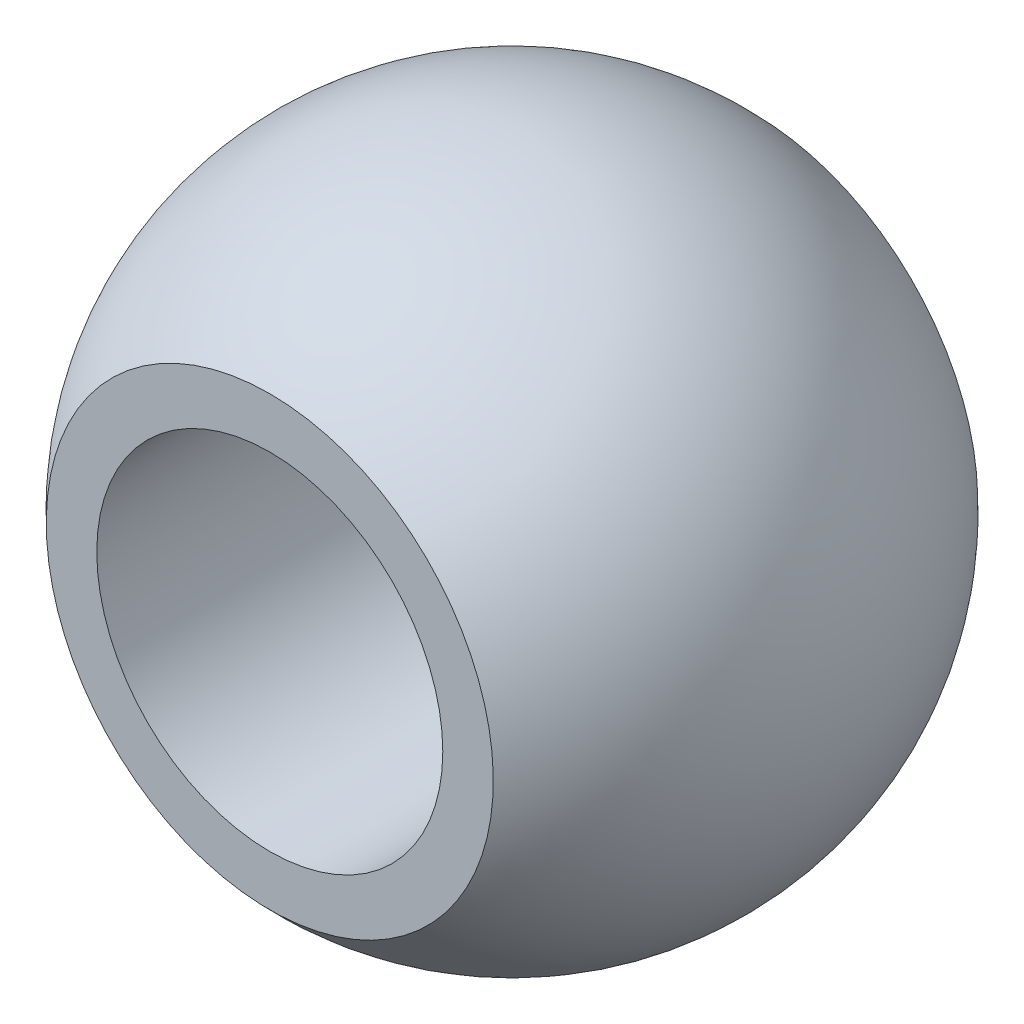
ISO-10303-21;
HEADER;
FILE_DESCRIPTION(('STEP AP214'),'2;1');
FILE_NAME('part.step','',(''),(''),'','','');
FILE_SCHEMA(('AUTOMOTIVE_DESIGN { 1 0 10303 214 1 1 1 1 }'));
ENDSEC;
DATA;
#1=APPLICATION_CONTEXT('core data for automotive mechanical design processes');
#2=APPLICATION_PROTOCOL_DEFINITION('international standard','automotive_design',2000,#1);
#3=PRODUCT_CONTEXT('',#1,'mechanical');
#4=PRODUCT('Part','Part','',(#3));
#5=PRODUCT_RELATED_PRODUCT_CATEGORY('part','',(#4));
#6=PRODUCT_DEFINITION_FORMATION('','',#4);
#7=PRODUCT_DEFINITION_CONTEXT('part definition',#1,'design');
#8=PRODUCT_DEFINITION('design','',#6,#7);
#9=PRODUCT_DEFINITION_SHAPE('','',#8);
#10=(LENGTH_UNIT() NAMED_UNIT(*) SI_UNIT(.MILLI.,.METRE.));
#11=(NAMED_UNIT(*) PLANE_ANGLE_UNIT() SI_UNIT($,.RADIAN.));
#12=(NAMED_UNIT(*) SI_UNIT($,.STERADIAN.) SOLID_ANGLE_UNIT());
#13=UNCERTAINTY_MEASURE_WITH_UNIT(LENGTH_MEASURE(1.E-05),#10,'distance_accuracy_value','');
#14=(GEOMETRIC_REPRESENTATION_CONTEXT(3) GLOBAL_UNCERTAINTY_ASSIGNED_CONTEXT((#13)) GLOBAL_UNIT_ASSIGNED_CONTEXT((#10,
#11,#12)) REPRESENTATION_CONTEXT('',''));
#15=CARTESIAN_POINT('',(0.,0.,0.));
#16=DIRECTION('',(0.,0.,1.));
#17=DIRECTION('',(1.,0.,0.));
#18=AXIS2_PLACEMENT_3D('',#15,#16,#17);
#19=CARTESIAN_POINT('',(0.,0.,0.));
#20=DIRECTION('',(0.,0.,1.));
#21=DIRECTION('',(0.,1.,0.));
#22=AXIS2_PLACEMENT_3D('',#19,#20,#21);
#23=SPHERICAL_SURFACE('',#22,9.525);
#24=CARTESIAN_POINT('',(0.,0.,7.));
#25=DIRECTION('',(0.,0.,1.));
#26=DIRECTION('',(1.,0.,0.));
#27=AXIS2_PLACEMENT_3D('',#24,#25,#26);
#28=CIRCLE('',#27,6.45953752214506);
#29=CARTESIAN_POINT('',(0.,6.45953752214506,7.));
#30=VERTEX_POINT('',#29);
#31=EDGE_CURVE('E49',#30,#30,#28,.T.);
#32=CARTESIAN_POINT('',(0.,0.,-7.));
#33=DIRECTION('',(0.,0.,1.));
#34=DIRECTION('',(1.,0.,0.));
#35=AXIS2_PLACEMENT_3D('',#32,#33,#34);
#36=CIRCLE('',#35,6.45953752214506);
#37=CARTESIAN_POINT('',(0.,6.45953752214506,-7.));
#38=VERTEX_POINT('',#37);
#39=EDGE_CURVE('E10',#38,#38,#36,.T.);
#40=CARTESIAN_POINT('',(0.,6.45953752214506,7.));
#41=CARTESIAN_POINT('',(0.,6.57993037529818,6.88890803991508));
#42=CARTESIAN_POINT('',(0.,6.69745158124721,6.77470469719588));
#43=CARTESIAN_POINT('',(0.,6.92645059857719,6.54039159966117));
#44=CARTESIAN_POINT('',(0.,7.03792840995814,6.42028184484566));
#45=CARTESIAN_POINT('',(0.,7.25454053799209,6.17447227629059));
#46=CARTESIAN_POINT('',(0.,7.35967485464508,6.04877246255103));
#47=CARTESIAN_POINT('',(0.,7.56332108630738,5.79211821958587));
#48=CARTESIAN_POINT('',(0.,7.66183300131669,5.66116379036026));
#49=CARTESIAN_POINT('',(0.,7.8519719936429,5.39434861650568));
#50=CARTESIAN_POINT('',(0.,7.9435990709598,5.25848787187671));
#51=CARTESIAN_POINT('',(0.,8.11972458546042,4.98222172800408));
#52=CARTESIAN_POINT('',(0.,8.20422302264415,4.84181632876042));
#53=CARTESIAN_POINT('',(0.,8.36586634458465,4.55683455112926));
#54=CARTESIAN_POINT('',(0.,8.44301122934143,4.41225817274177));
#55=CARTESIAN_POINT('',(0.,8.58974212802034,4.11931923517532));
#56=CARTESIAN_POINT('',(0.,8.65932814194247,3.97095667599636));
#57=CARTESIAN_POINT('',(0.,8.79075609272137,3.67084024639935));
#58=CARTESIAN_POINT('',(0.,8.85259802957815,3.51908637598129));
#59=CARTESIAN_POINT('',(0.,8.9683732326518,3.21259122107979));
#60=CARTESIAN_POINT('',(0.,9.02230649886867,3.05784993659634));
#61=CARTESIAN_POINT('',(0.,9.12212081579162,2.74579180139971));
#62=CARTESIAN_POINT('',(0.,9.1680018664977,2.58847495068653));
#63=CARTESIAN_POINT('',(0.,9.25158963882223,2.27168438591404));
#64=CARTESIAN_POINT('',(0.,9.28929636044068,2.11221067185473));
#65=CARTESIAN_POINT('',(0.,9.35643511717031,1.79153082379107));
#66=CARTESIAN_POINT('',(0.,9.38586715228148,1.63032468978673));
#67=CARTESIAN_POINT('',(0.,9.43637820187696,1.30660905612256));
#68=CARTESIAN_POINT('',(0.,9.45745721636126,1.14409955646274));
#69=CARTESIAN_POINT('',(0.,9.49120612236121,0.818209714716342));
#70=CARTESIAN_POINT('',(0.,9.50387601387686,0.654829372629771));
#71=CARTESIAN_POINT('',(0.,9.52077295269626,0.3276326870288));
#72=CARTESIAN_POINT('',(0.,9.525,0.1638163435144));
#73=CARTESIAN_POINT('',(0.,9.525,-0.163816343514402));
#74=CARTESIAN_POINT('',(0.,9.52077295269626,-0.327632687028802));
#75=CARTESIAN_POINT('',(0.,9.50387601387686,-0.654829372629773));
#76=CARTESIAN_POINT('',(0.,9.49120612236121,-0.818209714716344));
#77=CARTESIAN_POINT('',(0.,9.45745721636126,-1.14409955646274));
#78=CARTESIAN_POINT('',(0.,9.43637820187696,-1.30660905612257));
#79=CARTESIAN_POINT('',(0.,9.38586715228148,-1.63032468978673));
#80=CARTESIAN_POINT('',(0.,9.35643511717031,-1.79153082379108));
#81=CARTESIAN_POINT('',(0.,9.28929636044068,-2.11221067185473));
#82=CARTESIAN_POINT('',(0.,9.25158963882223,-2.27168438591404));
#83=CARTESIAN_POINT('',(0.,9.1680018664977,-2.58847495068653));
#84=CARTESIAN_POINT('',(0.,9.12212081579162,-2.74579180139971));
#85=CARTESIAN_POINT('',(0.,9.02230649886867,-3.05784993659634));
#86=CARTESIAN_POINT('',(0.,8.9683732326518,-3.21259122107979));
#87=CARTESIAN_POINT('',(0.,8.85259802957815,-3.5190863759813));
#88=CARTESIAN_POINT('',(0.,8.79075609272137,-3.67084024639935));
#89=CARTESIAN_POINT('',(0.,8.65932814194247,-3.97095667599636));
#90=CARTESIAN_POINT('',(0.,8.58974212802034,-4.11931923517532));
#91=CARTESIAN_POINT('',(0.,8.44301122934143,-4.41225817274177));
#92=CARTESIAN_POINT('',(0.,8.36586634458465,-4.55683455112927));
#93=CARTESIAN_POINT('',(0.,8.20422302264415,-4.84181632876042));
#94=CARTESIAN_POINT('',(0.,8.11972458546042,-4.98222172800408));
#95=CARTESIAN_POINT('',(0.,7.9435990709598,-5.25848787187671));
#96=CARTESIAN_POINT('',(0.,7.8519719936429,-5.39434861650569));
#97=CARTESIAN_POINT('',(0.,7.66183300131669,-5.66116379036026));
#98=CARTESIAN_POINT('',(0.,7.56332108630738,-5.79211821958587));
#99=CARTESIAN_POINT('',(0.,7.35967485464508,-6.04877246255103));
#100=CARTESIAN_POINT('',(0.,7.25454053799209,-6.17447227629059));
#101=CARTESIAN_POINT('',(0.,7.03792840995814,-6.42028184484566));
#102=CARTESIAN_POINT('',(0.,6.92645059857719,-6.54039159966117));
#103=CARTESIAN_POINT('',(0.,6.69745158124721,-6.77470469719588));
#104=CARTESIAN_POINT('',(0.,6.57993037529818,-6.88890803991508));
#105=CARTESIAN_POINT('',(0.,6.45953752214506,-7.));
#106=B_SPLINE_CURVE_WITH_KNOTS('',3,(#40,#41,#42,#43,#44,#45,#46,#47,#48,#49,#50,#51,#52,#53,
#54,#55,#56,#57,#58,#59,#60,#61,#62,#63,#64,#65,#66,#67,#68,#69,#70,#71,#72,#73,#74,#75,#76,#77,
#78,#79,#80,#81,#82,#83,#84,#85,#86,#87,#88,#89,#90,#91,#92,#93,#94,#95,#96,#97,#98,#99,#100,
#101,#102,#103,#104,#105),.UNSPECIFIED.,.F.,.F.,(4,2,2,2,2,2,2,2,2,2,2,2,2,2,2,2,2,2,2,2,2,2,2,
2,2,2,2,2,2,2,2,2,4),(0.,0.491394539439639,0.982789078879276,1.47418361831892,1.96557815775855,
2.45697269719819,2.94836723663783,3.43976177607747,3.93115631551711,4.42255085495674,
4.91394539439638,5.40533993383602,5.89673447327566,6.3881290127153,6.87952355215494,
7.37091809159457,7.86231263103421,8.35370717047385,8.84510170991349,9.33649624935313,
9.82789078879276,10.3192853282324,10.810679867672,11.3020744071117,11.7934689465513,
12.284863485991,12.7762580254306,13.2676525648702,13.7590471043099,14.2504416437495,
14.7418361831891,15.2332307226288,15.7246252620684),.UNSPECIFIED.);
#107=EDGE_CURVE('BSEAM35',#30,#38,#106,.T.);
#108=ORIENTED_EDGE('',*,*,#31,.F.);
#109=ORIENTED_EDGE('',*,*,#39,.T.);
#110=ORIENTED_EDGE('',*,*,#107,.T.);
#111=ORIENTED_EDGE('',*,*,#107,.F.);
#112=EDGE_LOOP('',(#108,#110,#109,#111));
#113=FACE_BOUND('',#112,.T.);
#114=ADVANCED_FACE('F35',(#113),#23,.T.);
#115=CARTESIAN_POINT('',(0.,5.,-7.));
#116=DIRECTION('',(0.,0.,1.));
#117=DIRECTION('',(1.,0.,0.));
#118=AXIS2_PLACEMENT_3D('',#115,#116,#117);
#119=PLANE('',#118);
#120=ORIENTED_EDGE('',*,*,#39,.F.);
#121=EDGE_LOOP('',(#120));
#122=FACE_BOUND('',#121,.T.);
#123=CARTESIAN_POINT('',(0.,0.,-7.));
#124=DIRECTION('',(0.,0.,1.));
#125=DIRECTION('',(1.,0.,0.));
#126=AXIS2_PLACEMENT_3D('',#123,#124,#125);
#127=CIRCLE('',#126,5.);
#128=CARTESIAN_POINT('',(5.,0.,-7.));
#129=VERTEX_POINT('',#128);
#130=EDGE_CURVE('E41',#129,#129,#127,.T.);
#131=ORIENTED_EDGE('',*,*,#130,.T.);
#132=EDGE_LOOP('',(#131));
#133=FACE_BOUND('',#132,.T.);
#134=ADVANCED_FACE('F58',(#122,#133),#119,.F.);
#135=CARTESIAN_POINT('',(0.,0.,7.));
#136=DIRECTION('',(0.,0.,1.));
#137=DIRECTION('',(1.,0.,0.));
#138=AXIS2_PLACEMENT_3D('',#135,#136,#137);
#139=CYLINDRICAL_SURFACE('',#138,5.);
#140=ORIENTED_EDGE('',*,*,#130,.F.);
#141=EDGE_LOOP('',(#140));
#142=FACE_BOUND('',#141,.T.);
#143=CARTESIAN_POINT('',(0.,0.,7.));
#144=DIRECTION('',(0.,0.,1.));
#145=DIRECTION('',(1.,0.,0.));
#146=AXIS2_PLACEMENT_3D('',#143,#144,#145);
#147=CIRCLE('',#146,5.);
#148=CARTESIAN_POINT('',(5.,0.,7.));
#149=VERTEX_POINT('',#148);
#150=EDGE_CURVE('E45',#149,#149,#147,.T.);
#151=ORIENTED_EDGE('',*,*,#150,.T.);
#152=EDGE_LOOP('',(#151));
#153=FACE_BOUND('',#152,.T.);
#154=ADVANCED_FACE('F62',(#142,#153),#139,.F.);
#155=CARTESIAN_POINT('',(0.,6.45953752214506,7.));
#156=DIRECTION('',(0.,0.,-1.));
#157=DIRECTION('',(-1.,0.,0.));
#158=AXIS2_PLACEMENT_3D('',#155,#156,#157);
#159=PLANE('',#158);
#160=ORIENTED_EDGE('',*,*,#150,.F.);
#161=EDGE_LOOP('',(#160));
#162=FACE_BOUND('',#161,.T.);
#163=ORIENTED_EDGE('',*,*,#31,.T.);
#164=EDGE_LOOP('',(#163));
#165=FACE_BOUND('',#164,.T.);
#166=ADVANCED_FACE('F55',(#162,#165),#159,.F.);
#167=CLOSED_SHELL('',(#114,#134,#154,#166));
#168=MANIFOLD_SOLID_BREP('B2',#167);
#169=ADVANCED_BREP_SHAPE_REPRESENTATION('',(#18,#168),#14);
#170=SHAPE_DEFINITION_REPRESENTATION(#9,#169);
ENDSEC;
END-ISO-10303-21;
